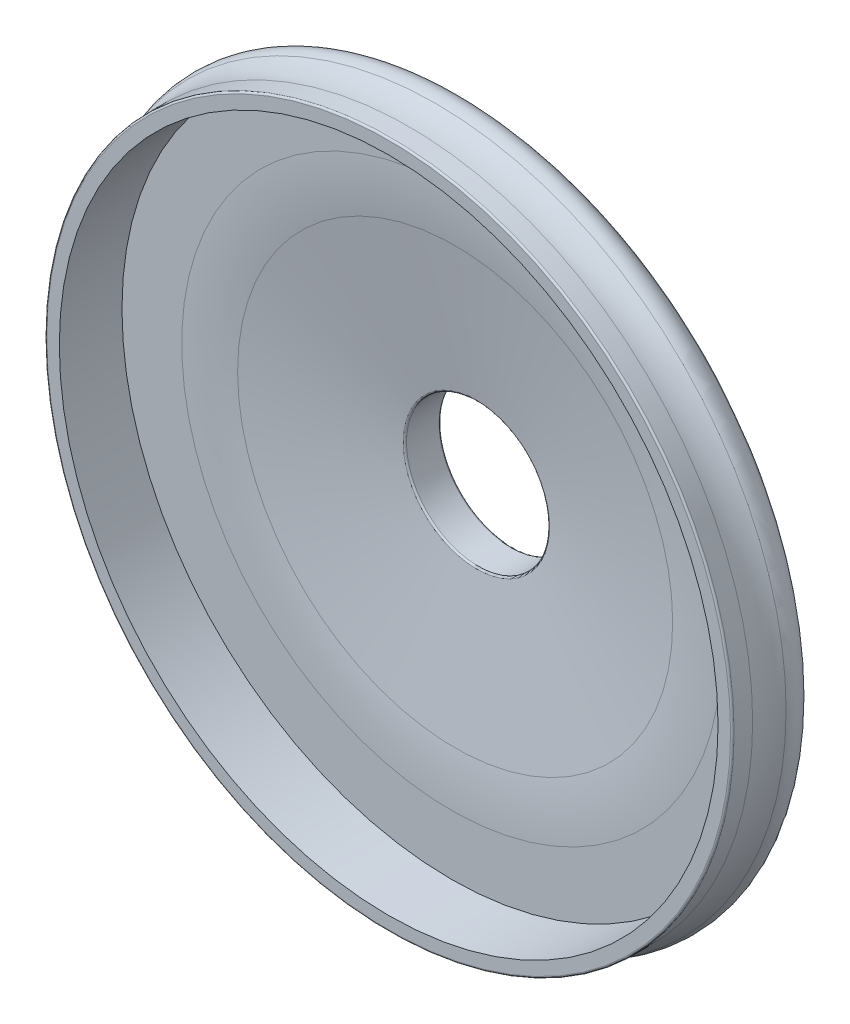
ISO-10303-21;
HEADER;
FILE_DESCRIPTION(('STEP AP214'),'2;1');
FILE_NAME('part.step','',(''),(''),'','','');
FILE_SCHEMA(('AUTOMOTIVE_DESIGN { 1 0 10303 214 1 1 1 1 }'));
ENDSEC;
DATA;
#1=APPLICATION_CONTEXT('core data for automotive mechanical design processes');
#2=APPLICATION_PROTOCOL_DEFINITION('international standard','automotive_design',2000,#1);
#3=PRODUCT_CONTEXT('',#1,'mechanical');
#4=PRODUCT('Part','Part','',(#3));
#5=PRODUCT_RELATED_PRODUCT_CATEGORY('part','',(#4));
#6=PRODUCT_DEFINITION_FORMATION('','',#4);
#7=PRODUCT_DEFINITION_CONTEXT('part definition',#1,'design');
#8=PRODUCT_DEFINITION('design','',#6,#7);
#9=PRODUCT_DEFINITION_SHAPE('','',#8);
#10=(LENGTH_UNIT() NAMED_UNIT(*) SI_UNIT(.MILLI.,.METRE.));
#11=(NAMED_UNIT(*) PLANE_ANGLE_UNIT() SI_UNIT($,.RADIAN.));
#12=(NAMED_UNIT(*) SI_UNIT($,.STERADIAN.) SOLID_ANGLE_UNIT());
#13=UNCERTAINTY_MEASURE_WITH_UNIT(LENGTH_MEASURE(1.E-05),#10,'distance_accuracy_value','');
#14=(GEOMETRIC_REPRESENTATION_CONTEXT(3) GLOBAL_UNCERTAINTY_ASSIGNED_CONTEXT((#13)) GLOBAL_UNIT_ASSIGNED_CONTEXT((#10,
#11,#12)) REPRESENTATION_CONTEXT('',''));
#15=CARTESIAN_POINT('',(0.,0.,0.));
#16=DIRECTION('',(0.,0.,1.));
#17=DIRECTION('',(1.,0.,0.));
#18=AXIS2_PLACEMENT_3D('',#15,#16,#17);
#19=CARTESIAN_POINT('',(0.,0.,0.));
#20=DIRECTION('',(0.,0.,1.));
#21=DIRECTION('',(1.,0.,0.));
#22=AXIS2_PLACEMENT_3D('',#19,#20,#21);
#23=CONICAL_SURFACE('',#22,8.5,1.42478406908362);
#24=CARTESIAN_POINT('',(0.,0.,-0.949599220518344));
#25=DIRECTION('',(0.,0.,-1.));
#26=DIRECTION('',(-1.,0.,0.));
#27=AXIS2_PLACEMENT_3D('',#24,#25,#26);
#28=CIRCLE('',#27,2.04272530047526);
#29=CARTESIAN_POINT('',(-2.04272530047526,0.,-0.949599220518344));
#30=VERTEX_POINT('',#29);
#31=EDGE_CURVE('E63',#30,#30,#28,.T.);
#32=ORIENTED_EDGE('',*,*,#31,.T.);
#33=EDGE_LOOP('',(#32));
#34=FACE_BOUND('',#33,.T.);
#35=CARTESIAN_POINT('',(0.,0.,-0.356408646351468));
#36=DIRECTION('',(0.,0.,1.));
#37=DIRECTION('',(1.,0.,0.));
#38=AXIS2_PLACEMENT_3D('',#35,#36,#37);
#39=CIRCLE('',#38,6.07642120481002);
#40=CARTESIAN_POINT('',(6.07642120481002,0.,-0.356408646351468));
#41=VERTEX_POINT('',#40);
#42=EDGE_CURVE('E92',#41,#41,#39,.T.);
#43=ORIENTED_EDGE('',*,*,#42,.T.);
#44=EDGE_LOOP('',(#43));
#45=FACE_BOUND('',#44,.T.);
#46=ADVANCED_FACE('F51',(#34,#45),#23,.F.);
#47=CARTESIAN_POINT('',(0.,0.,1.5));
#48=DIRECTION('',(0.,0.,1.));
#49=DIRECTION('',(1.,0.,0.));
#50=AXIS2_PLACEMENT_3D('',#47,#48,#49);
#51=PLANE('',#50);
#52=CARTESIAN_POINT('',(0.,0.,1.5));
#53=DIRECTION('',(0.,0.,1.));
#54=DIRECTION('',(1.,0.,0.));
#55=AXIS2_PLACEMENT_3D('',#52,#53,#54);
#56=CIRCLE('',#55,9.55);
#57=CARTESIAN_POINT('',(9.55,0.,1.5));
#58=VERTEX_POINT('',#57);
#59=EDGE_CURVE('E56',#58,#58,#56,.T.);
#60=ORIENTED_EDGE('',*,*,#59,.T.);
#61=EDGE_LOOP('',(#60));
#62=FACE_BOUND('',#61,.T.);
#63=CARTESIAN_POINT('',(0.,0.,1.5));
#64=DIRECTION('',(0.,0.,1.));
#65=DIRECTION('',(1.,0.,0.));
#66=AXIS2_PLACEMENT_3D('',#63,#64,#65);
#67=CIRCLE('',#66,9.2);
#68=CARTESIAN_POINT('',(9.2,0.,1.5));
#69=VERTEX_POINT('',#68);
#70=EDGE_CURVE('E101',#69,#69,#67,.T.);
#71=ORIENTED_EDGE('',*,*,#70,.F.);
#72=EDGE_LOOP('',(#71));
#73=FACE_BOUND('',#72,.T.);
#74=ADVANCED_FACE('F124',(#62,#73),#51,.T.);
#75=CARTESIAN_POINT('',(0.,0.,1.5));
#76=DIRECTION('',(0.,0.,-1.));
#77=DIRECTION('',(-1.,0.,0.));
#78=AXIS2_PLACEMENT_3D('',#75,#76,#77);
#79=CYLINDRICAL_SURFACE('',#78,9.6);
#80=CARTESIAN_POINT('',(0.,0.,1.45));
#81=DIRECTION('',(0.,0.,1.));
#82=DIRECTION('',(1.,0.,0.));
#83=AXIS2_PLACEMENT_3D('',#80,#81,#82);
#84=CIRCLE('',#83,9.6);
#85=CARTESIAN_POINT('',(9.6,0.,1.45));
#86=VERTEX_POINT('',#85);
#87=EDGE_CURVE('E11',#86,#86,#84,.F.);
#88=ORIENTED_EDGE('',*,*,#87,.T.);
#89=EDGE_LOOP('',(#88));
#90=FACE_BOUND('',#89,.T.);
#91=CARTESIAN_POINT('',(0.,0.,0.932737905308883));
#92=DIRECTION('',(0.,0.,-1.));
#93=DIRECTION('',(-1.,0.,0.));
#94=AXIS2_PLACEMENT_3D('',#91,#92,#93);
#95=CIRCLE('',#94,9.6);
#96=CARTESIAN_POINT('',(-9.6,0.,0.932737905308883));
#97=VERTEX_POINT('',#96);
#98=EDGE_CURVE('E100',#97,#97,#95,.F.);
#99=ORIENTED_EDGE('',*,*,#98,.T.);
#100=EDGE_LOOP('',(#99));
#101=FACE_BOUND('',#100,.T.);
#102=ADVANCED_FACE('F122',(#90,#101),#79,.T.);
#103=CARTESIAN_POINT('',(0.,0.,1.5));
#104=DIRECTION('',(0.,0.,-1.));
#105=DIRECTION('',(-1.,0.,0.));
#106=AXIS2_PLACEMENT_3D('',#103,#104,#105);
#107=CYLINDRICAL_SURFACE('',#106,9.2);
#108=ORIENTED_EDGE('',*,*,#70,.T.);
#109=EDGE_LOOP('',(#108));
#110=FACE_BOUND('',#109,.T.);
#111=CARTESIAN_POINT('',(0.,0.,-0.25));
#112=DIRECTION('',(0.,0.,1.));
#113=DIRECTION('',(1.,0.,0.));
#114=AXIS2_PLACEMENT_3D('',#111,#112,#113);
#115=CIRCLE('',#114,9.2);
#116=CARTESIAN_POINT('',(9.2,0.,-0.25));
#117=VERTEX_POINT('',#116);
#118=EDGE_CURVE('E110',#117,#117,#115,.T.);
#119=ORIENTED_EDGE('',*,*,#118,.F.);
#120=EDGE_LOOP('',(#119));
#121=FACE_BOUND('',#120,.T.);
#122=ADVANCED_FACE('F116',(#110,#121),#107,.F.);
#123=CARTESIAN_POINT('',(0.,0.,0.));
#124=DIRECTION('',(1.,0.,0.));
#125=DIRECTION('',(0.,1.,0.));
#126=AXIS2_PLACEMENT_3D('',#123,#124,#125);
#127=ELLIPSE('',#126,9.9,2.);
#128=TRIMMED_CURVE('',#127,(PARAMETER_VALUE(4.71238898038469)),
(PARAMETER_VALUE(7.85398163397448)),.T.,.PARAMETER.);
#129=CARTESIAN_POINT('',(0.,0.,0.));
#130=DIRECTION('',(0.,0.,1.));
#131=AXIS1_PLACEMENT('',#129,#130);
#132=SURFACE_OF_REVOLUTION('',#128,#131);
#133=CARTESIAN_POINT('',(0.,0.,-1.95656047579064));
#134=DIRECTION('',(0.,0.,1.));
#135=DIRECTION('',(1.,0.,0.));
#136=AXIS2_PLACEMENT_3D('',#133,#134,#135);
#137=CIRCLE('',#136,2.05213833350045);
#138=CARTESIAN_POINT('',(2.05213833350045,0.,-1.95656047579064));
#139=VERTEX_POINT('',#138);
#140=EDGE_CURVE('E79',#139,#139,#137,.T.);
#141=ORIENTED_EDGE('',*,*,#140,.T.);
#142=EDGE_LOOP('',(#141));
#143=FACE_BOUND('',#142,.T.);
#144=CARTESIAN_POINT('',(0.,0.,-0.408193714867018));
#145=DIRECTION('',(0.,0.,1.));
#146=DIRECTION('',(1.,0.,0.));
#147=AXIS2_PLACEMENT_3D('',#144,#145,#146);
#148=CIRCLE('',#147,9.69161192876257);
#149=CARTESIAN_POINT('',(9.69161192876257,0.,-0.408193714867018));
#150=VERTEX_POINT('',#149);
#151=EDGE_CURVE('E82',#150,#150,#148,.F.);
#152=ORIENTED_EDGE('',*,*,#151,.T.);
#153=EDGE_LOOP('',(#152));
#154=FACE_BOUND('',#153,.T.);
#155=ADVANCED_FACE('F111',(#143,#154),#132,.T.);
#156=CARTESIAN_POINT('',(0.,0.,-8.5));
#157=DIRECTION('',(0.,0.,1.));
#158=DIRECTION('',(1.,0.,0.));
#159=AXIS2_PLACEMENT_3D('',#156,#157,#158);
#160=CYLINDRICAL_SURFACE('',#159,2.);
#161=CARTESIAN_POINT('',(0.,0.,-1.90660622141886));
#162=DIRECTION('',(0.,0.,-1.));
#163=DIRECTION('',(-1.,0.,0.));
#164=AXIS2_PLACEMENT_3D('',#161,#162,#163);
#165=CIRCLE('',#164,2.);
#166=CARTESIAN_POINT('',(-2.,0.,-1.90660622141886));
#167=VERTEX_POINT('',#166);
#168=EDGE_CURVE('E69',#167,#167,#165,.T.);
#169=ORIENTED_EDGE('',*,*,#168,.T.);
#170=EDGE_LOOP('',(#169));
#171=FACE_BOUND('',#170,.T.);
#172=CARTESIAN_POINT('',(0.,0.,-0.999067177286587));
#173=DIRECTION('',(0.,0.,1.));
#174=DIRECTION('',(1.,0.,0.));
#175=AXIS2_PLACEMENT_3D('',#172,#173,#174);
#176=CIRCLE('',#175,2.);
#177=CARTESIAN_POINT('',(2.,0.,-0.999067177286587));
#178=VERTEX_POINT('',#177);
#179=EDGE_CURVE('E71',#178,#178,#176,.T.);
#180=ORIENTED_EDGE('',*,*,#179,.T.);
#181=EDGE_LOOP('',(#180));
#182=FACE_BOUND('',#181,.T.);
#183=ADVANCED_FACE('F114',(#171,#182),#160,.F.);
#184=CARTESIAN_POINT('',(0.,0.,0.932737905308883));
#185=DIRECTION('',(0.,0.,-1.));
#186=DIRECTION('',(-1.,0.,0.));
#187=AXIS2_PLACEMENT_3D('',#184,#185,#186);
#188=TOROIDAL_SURFACE('',#187,11.2,1.6);
#189=CARTESIAN_POINT('',(0.,0.,0.184658223155194));
#190=DIRECTION('',(0.,0.,1.));
#191=DIRECTION('',(1.,0.,0.));
#192=AXIS2_PLACEMENT_3D('',#189,#190,#191);
#193=CIRCLE('',#192,9.78565322881945);
#194=CARTESIAN_POINT('',(9.78565322881945,0.,0.184658223155194));
#195=VERTEX_POINT('',#194);
#196=EDGE_CURVE('E90',#195,#195,#193,.T.);
#197=ORIENTED_EDGE('',*,*,#196,.T.);
#198=EDGE_LOOP('',(#197));
#199=FACE_BOUND('',#198,.T.);
#200=ORIENTED_EDGE('',*,*,#98,.F.);
#201=EDGE_LOOP('',(#200));
#202=FACE_BOUND('',#201,.T.);
#203=ADVANCED_FACE('F127',(#199,#202),#188,.F.);
#204=CARTESIAN_POINT('',(0.,0.,-0.25));
#205=DIRECTION('',(0.,0.,1.));
#206=DIRECTION('',(1.,0.,0.));
#207=AXIS2_PLACEMENT_3D('',#204,#205,#206);
#208=PLANE('',#207);
#209=CARTESIAN_POINT('',(0.,0.,-0.25));
#210=DIRECTION('',(0.,0.,1.));
#211=DIRECTION('',(1.,0.,0.));
#212=AXIS2_PLACEMENT_3D('',#209,#210,#211);
#213=CIRCLE('',#212,7.53136110975833);
#214=CARTESIAN_POINT('',(7.53136110975833,0.,-0.25));
#215=VERTEX_POINT('',#214);
#216=EDGE_CURVE('E91',#215,#215,#213,.F.);
#217=ORIENTED_EDGE('',*,*,#216,.T.);
#218=EDGE_LOOP('',(#217));
#219=FACE_BOUND('',#218,.T.);
#220=ORIENTED_EDGE('',*,*,#118,.T.);
#221=EDGE_LOOP('',(#220));
#222=FACE_BOUND('',#221,.T.);
#223=ADVANCED_FACE('F133',(#219,#222),#208,.T.);
#224=CARTESIAN_POINT('',(0.,0.,-10.25));
#225=DIRECTION('',(0.,0.,1.));
#226=DIRECTION('',(1.,0.,0.));
#227=AXIS2_PLACEMENT_3D('',#224,#225,#226);
#228=DEGENERATE_TOROIDAL_SURFACE('',#227,7.53136110975833,10.,.T.);
#229=ORIENTED_EDGE('',*,*,#42,.F.);
#230=EDGE_LOOP('',(#229));
#231=FACE_BOUND('',#230,.T.);
#232=ORIENTED_EDGE('',*,*,#216,.F.);
#233=EDGE_LOOP('',(#232));
#234=FACE_BOUND('',#233,.T.);
#235=ADVANCED_FACE('F131',(#231,#234),#228,.T.);
#236=CARTESIAN_POINT('',(0.,0.,-0.0491166775178336));
#237=DIRECTION('',(0.,0.,-1.));
#238=DIRECTION('',(-1.,0.,0.));
#239=AXIS2_PLACEMENT_3D('',#236,#237,#238);
#240=TOROIDAL_SURFACE('',#239,9.34366986282553,0.5);
#241=ORIENTED_EDGE('',*,*,#151,.F.);
#242=EDGE_LOOP('',(#241));
#243=FACE_BOUND('',#242,.T.);
#244=ORIENTED_EDGE('',*,*,#196,.F.);
#245=EDGE_LOOP('',(#244));
#246=FACE_BOUND('',#245,.T.);
#247=ADVANCED_FACE('F137',(#243,#246),#240,.T.);
#248=CARTESIAN_POINT('',(0.,0.,-1.90660622141886));
#249=DIRECTION('',(0.,0.,-1.));
#250=DIRECTION('',(-1.,0.,0.));
#251=AXIS2_PLACEMENT_3D('',#248,#249,#250);
#252=TOROIDAL_SURFACE('',#251,2.05,0.05);
#253=ORIENTED_EDGE('',*,*,#168,.F.);
#254=EDGE_LOOP('',(#253));
#255=FACE_BOUND('',#254,.T.);
#256=ORIENTED_EDGE('',*,*,#140,.F.);
#257=EDGE_LOOP('',(#256));
#258=FACE_BOUND('',#257,.T.);
#259=ADVANCED_FACE('F136',(#255,#258),#252,.T.);
#260=CARTESIAN_POINT('',(0.,0.,-0.999067177286587));
#261=DIRECTION('',(0.,0.,1.));
#262=DIRECTION('',(1.,0.,0.));
#263=AXIS2_PLACEMENT_3D('',#260,#261,#262);
#264=TOROIDAL_SURFACE('',#263,2.05,0.05);
#265=ORIENTED_EDGE('',*,*,#179,.F.);
#266=EDGE_LOOP('',(#265));
#267=FACE_BOUND('',#266,.T.);
#268=ORIENTED_EDGE('',*,*,#31,.F.);
#269=EDGE_LOOP('',(#268));
#270=FACE_BOUND('',#269,.T.);
#271=ADVANCED_FACE('F141',(#267,#270),#264,.T.);
#272=CARTESIAN_POINT('',(0.,0.,1.45));
#273=DIRECTION('',(0.,0.,1.));
#274=DIRECTION('',(1.,0.,0.));
#275=AXIS2_PLACEMENT_3D('',#272,#273,#274);
#276=TOROIDAL_SURFACE('',#275,9.55,0.05);
#277=ORIENTED_EDGE('',*,*,#87,.F.);
#278=EDGE_LOOP('',(#277));
#279=FACE_BOUND('',#278,.T.);
#280=ORIENTED_EDGE('',*,*,#59,.F.);
#281=EDGE_LOOP('',(#280));
#282=FACE_BOUND('',#281,.T.);
#283=ADVANCED_FACE('F52',(#279,#282),#276,.T.);
#284=CLOSED_SHELL('',(#46,#74,#102,#122,#155,#183,#203,#223,#235,#247,#259,#271,#283));
#285=MANIFOLD_SOLID_BREP('B2',#284);
#286=ADVANCED_BREP_SHAPE_REPRESENTATION('',(#18,#285),#14);
#287=SHAPE_DEFINITION_REPRESENTATION(#9,#286);
ENDSEC;
END-ISO-10303-21;
